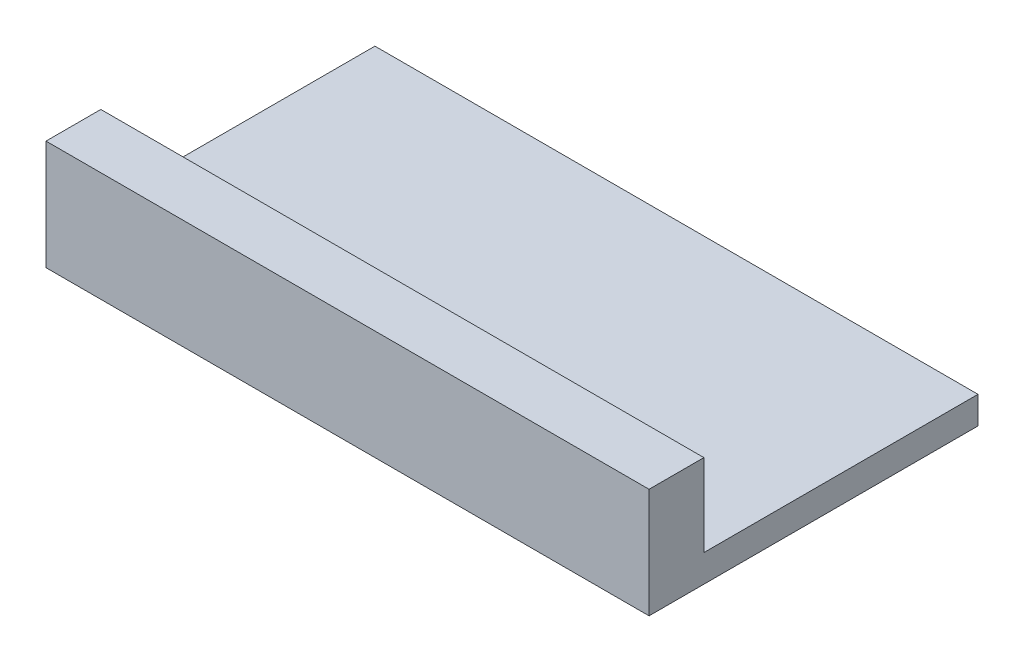
ISO-10303-21;
HEADER;
FILE_DESCRIPTION(('STEP AP214'),'2;1');
FILE_NAME('part.step','',(''),(''),'','','');
FILE_SCHEMA(('AUTOMOTIVE_DESIGN { 1 0 10303 214 1 1 1 1 }'));
ENDSEC;
DATA;
#1=APPLICATION_CONTEXT('core data for automotive mechanical design processes');
#2=APPLICATION_PROTOCOL_DEFINITION('international standard','automotive_design',2000,#1);
#3=PRODUCT_CONTEXT('',#1,'mechanical');
#4=PRODUCT('Part','Part','',(#3));
#5=PRODUCT_RELATED_PRODUCT_CATEGORY('part','',(#4));
#6=PRODUCT_DEFINITION_FORMATION('','',#4);
#7=PRODUCT_DEFINITION_CONTEXT('part definition',#1,'design');
#8=PRODUCT_DEFINITION('design','',#6,#7);
#9=PRODUCT_DEFINITION_SHAPE('','',#8);
#10=(LENGTH_UNIT() NAMED_UNIT(*) SI_UNIT(.MILLI.,.METRE.));
#11=(NAMED_UNIT(*) PLANE_ANGLE_UNIT() SI_UNIT($,.RADIAN.));
#12=(NAMED_UNIT(*) SI_UNIT($,.STERADIAN.) SOLID_ANGLE_UNIT());
#13=UNCERTAINTY_MEASURE_WITH_UNIT(LENGTH_MEASURE(1.E-05),#10,'distance_accuracy_value','');
#14=(GEOMETRIC_REPRESENTATION_CONTEXT(3) GLOBAL_UNCERTAINTY_ASSIGNED_CONTEXT((#13)) GLOBAL_UNIT_ASSIGNED_CONTEXT((#10,
#11,#12)) REPRESENTATION_CONTEXT('',''));
#15=CARTESIAN_POINT('',(0.,0.,0.));
#16=DIRECTION('',(0.,0.,1.));
#17=DIRECTION('',(1.,0.,0.));
#18=AXIS2_PLACEMENT_3D('',#15,#16,#17);
#19=CARTESIAN_POINT('',(-53.34,0.,21.59));
#20=DIRECTION('',(0.,1.,0.));
#21=DIRECTION('',(0.,0.,1.));
#22=AXIS2_PLACEMENT_3D('',#19,#20,#21);
#23=CYLINDRICAL_SURFACE('',#22,2.032);
#24=CARTESIAN_POINT('',(-53.34,6.35,21.59));
#25=DIRECTION('',(0.,1.,0.));
#26=DIRECTION('',(0.,0.,1.));
#27=AXIS2_PLACEMENT_3D('',#24,#25,#26);
#28=CIRCLE('',#27,2.032);
#29=CARTESIAN_POINT('',(-53.34,6.35,23.622));
#30=VERTEX_POINT('',#29);
#31=EDGE_CURVE('E178',#30,#30,#28,.T.);
#32=ORIENTED_EDGE('',*,*,#31,.T.);
#33=EDGE_LOOP('',(#32));
#34=FACE_BOUND('',#33,.T.);
#35=CARTESIAN_POINT('',(-53.34,3.048,21.59));
#36=DIRECTION('',(0.,-1.,0.));
#37=DIRECTION('',(0.,0.,-1.));
#38=AXIS2_PLACEMENT_3D('',#35,#36,#37);
#39=CIRCLE('',#38,2.032);
#40=CARTESIAN_POINT('',(-53.34,3.048,19.558));
#41=VERTEX_POINT('',#40);
#42=EDGE_CURVE('E37',#41,#41,#39,.F.);
#43=ORIENTED_EDGE('',*,*,#42,.F.);
#44=EDGE_LOOP('',(#43));
#45=FACE_BOUND('',#44,.T.);
#46=ADVANCED_FACE('F33',(#34,#45),#23,.F.);
#47=CARTESIAN_POINT('',(0.,6.35,0.));
#48=DIRECTION('',(0.,-1.,0.));
#49=DIRECTION('',(0.,0.,-1.));
#50=AXIS2_PLACEMENT_3D('',#47,#48,#49);
#51=PLANE('',#50);
#52=ORIENTED_EDGE('',*,*,#31,.F.);
#53=EDGE_LOOP('',(#52));
#54=FACE_BOUND('',#53,.T.);
#55=DIRECTION('',(-1.,0.,0.));
#56=VECTOR('',#55,1.);
#57=CARTESIAN_POINT('',(69.85,6.35,25.4));
#58=LINE('',#57,#56);
#59=CARTESIAN_POINT('',(69.85,6.35,25.4));
#60=VERTEX_POINT('',#59);
#61=CARTESIAN_POINT('',(-69.85,6.35,25.4));
#62=VERTEX_POINT('',#61);
#63=EDGE_CURVE('E57',#60,#62,#58,.T.);
#64=ORIENTED_EDGE('',*,*,#63,.F.);
#65=DIRECTION('',(0.,0.,-1.));
#66=VECTOR('',#65,1.);
#67=CARTESIAN_POINT('',(69.85,6.35,38.1));
#68=LINE('',#67,#66);
#69=CARTESIAN_POINT('',(69.85,6.35,-38.1));
#70=VERTEX_POINT('',#69);
#71=EDGE_CURVE('E201',#60,#70,#68,.T.);
#72=ORIENTED_EDGE('',*,*,#71,.T.);
#73=DIRECTION('',(-1.,0.,0.));
#74=VECTOR('',#73,1.);
#75=CARTESIAN_POINT('',(-69.85,6.35,-38.1));
#76=LINE('',#75,#74);
#77=CARTESIAN_POINT('',(-69.85,6.35,-38.1));
#78=VERTEX_POINT('',#77);
#79=EDGE_CURVE('E204',#70,#78,#76,.T.);
#80=ORIENTED_EDGE('',*,*,#79,.T.);
#81=DIRECTION('',(0.,0.,1.));
#82=VECTOR('',#81,1.);
#83=CARTESIAN_POINT('',(-69.85,6.35,38.1));
#84=LINE('',#83,#82);
#85=EDGE_CURVE('E199',#78,#62,#84,.T.);
#86=ORIENTED_EDGE('',*,*,#85,.T.);
#87=EDGE_LOOP('',(#64,#72,#80,#86));
#88=FACE_BOUND('',#87,.T.);
#89=ADVANCED_FACE('F240',(#54,#88),#51,.F.);
#90=CARTESIAN_POINT('',(-69.85,6.35,38.1));
#91=DIRECTION('',(1.,0.,0.));
#92=DIRECTION('',(0.,0.,-1.));
#93=AXIS2_PLACEMENT_3D('',#90,#91,#92);
#94=PLANE('',#93);
#95=DIRECTION('',(0.,0.,1.));
#96=VECTOR('',#95,1.);
#97=CARTESIAN_POINT('',(-69.85,0.,38.1));
#98=LINE('',#97,#96);
#99=CARTESIAN_POINT('',(-69.85,0.,-38.1));
#100=VERTEX_POINT('',#99);
#101=CARTESIAN_POINT('',(-69.85,0.,38.1));
#102=VERTEX_POINT('',#101);
#103=EDGE_CURVE('E198',#100,#102,#98,.T.);
#104=ORIENTED_EDGE('',*,*,#103,.T.);
#105=DIRECTION('',(0.,-1.,0.));
#106=VECTOR('',#105,1.);
#107=CARTESIAN_POINT('',(-69.85,6.35,38.1));
#108=LINE('',#107,#106);
#109=CARTESIAN_POINT('',(-69.85,25.4,38.1));
#110=VERTEX_POINT('',#109);
#111=EDGE_CURVE('E11',#110,#102,#108,.T.);
#112=ORIENTED_EDGE('',*,*,#111,.F.);
#113=DIRECTION('',(0.,0.,1.));
#114=VECTOR('',#113,1.);
#115=CARTESIAN_POINT('',(-69.85,25.4,25.4));
#116=LINE('',#115,#114);
#117=CARTESIAN_POINT('',(-69.85,25.4,25.4));
#118=VERTEX_POINT('',#117);
#119=EDGE_CURVE('E181',#118,#110,#116,.T.);
#120=ORIENTED_EDGE('',*,*,#119,.F.);
#121=DIRECTION('',(0.,-1.,0.));
#122=VECTOR('',#121,1.);
#123=CARTESIAN_POINT('',(-69.85,25.4,25.4));
#124=LINE('',#123,#122);
#125=EDGE_CURVE('E191',#118,#62,#124,.T.);
#126=ORIENTED_EDGE('',*,*,#125,.T.);
#127=ORIENTED_EDGE('',*,*,#85,.F.);
#128=DIRECTION('',(0.,-1.,0.));
#129=VECTOR('',#128,1.);
#130=CARTESIAN_POINT('',(-69.85,6.35,-38.1));
#131=LINE('',#130,#129);
#132=EDGE_CURVE('E206',#78,#100,#131,.T.);
#133=ORIENTED_EDGE('',*,*,#132,.T.);
#134=EDGE_LOOP('',(#104,#112,#120,#126,#127,#133));
#135=FACE_BOUND('',#134,.T.);
#136=ADVANCED_FACE('F35',(#135),#94,.F.);
#137=CARTESIAN_POINT('',(-69.85,6.35,38.1));
#138=DIRECTION('',(0.,0.,-1.));
#139=DIRECTION('',(-1.,0.,0.));
#140=AXIS2_PLACEMENT_3D('',#137,#138,#139);
#141=PLANE('',#140);
#142=DIRECTION('',(1.,0.,0.));
#143=VECTOR('',#142,1.);
#144=CARTESIAN_POINT('',(-69.85,0.,38.1));
#145=LINE('',#144,#143);
#146=CARTESIAN_POINT('',(69.85,0.,38.1));
#147=VERTEX_POINT('',#146);
#148=EDGE_CURVE('E209',#102,#147,#145,.T.);
#149=ORIENTED_EDGE('',*,*,#148,.T.);
#150=DIRECTION('',(0.,-1.,0.));
#151=VECTOR('',#150,1.);
#152=CARTESIAN_POINT('',(69.85,6.35,38.1));
#153=LINE('',#152,#151);
#154=CARTESIAN_POINT('',(69.85,25.4,38.1));
#155=VERTEX_POINT('',#154);
#156=EDGE_CURVE('E42',#155,#147,#153,.T.);
#157=ORIENTED_EDGE('',*,*,#156,.F.);
#158=DIRECTION('',(1.,0.,0.));
#159=VECTOR('',#158,1.);
#160=CARTESIAN_POINT('',(-69.85,25.4,38.1));
#161=LINE('',#160,#159);
#162=EDGE_CURVE('E184',#110,#155,#161,.T.);
#163=ORIENTED_EDGE('',*,*,#162,.F.);
#164=ORIENTED_EDGE('',*,*,#111,.T.);
#165=EDGE_LOOP('',(#149,#157,#163,#164));
#166=FACE_BOUND('',#165,.T.);
#167=ADVANCED_FACE('F246',(#166),#141,.F.);
#168=CARTESIAN_POINT('',(69.85,6.35,38.1));
#169=DIRECTION('',(-1.,0.,0.));
#170=DIRECTION('',(0.,0.,1.));
#171=AXIS2_PLACEMENT_3D('',#168,#169,#170);
#172=PLANE('',#171);
#173=DIRECTION('',(0.,0.,-1.));
#174=VECTOR('',#173,1.);
#175=CARTESIAN_POINT('',(69.85,0.,38.1));
#176=LINE('',#175,#174);
#177=CARTESIAN_POINT('',(69.85,0.,-38.1));
#178=VERTEX_POINT('',#177);
#179=EDGE_CURVE('E211',#147,#178,#176,.T.);
#180=ORIENTED_EDGE('',*,*,#179,.T.);
#181=DIRECTION('',(0.,-1.,0.));
#182=VECTOR('',#181,1.);
#183=CARTESIAN_POINT('',(69.85,6.35,-38.1));
#184=LINE('',#183,#182);
#185=EDGE_CURVE('E216',#70,#178,#184,.T.);
#186=ORIENTED_EDGE('',*,*,#185,.F.);
#187=ORIENTED_EDGE('',*,*,#71,.F.);
#188=DIRECTION('',(0.,-1.,0.));
#189=VECTOR('',#188,1.);
#190=CARTESIAN_POINT('',(69.85,25.4,25.4));
#191=LINE('',#190,#189);
#192=CARTESIAN_POINT('',(69.85,25.4,25.4));
#193=VERTEX_POINT('',#192);
#194=EDGE_CURVE('E195',#193,#60,#191,.T.);
#195=ORIENTED_EDGE('',*,*,#194,.F.);
#196=DIRECTION('',(0.,0.,-1.));
#197=VECTOR('',#196,1.);
#198=CARTESIAN_POINT('',(69.85,25.4,38.1));
#199=LINE('',#198,#197);
#200=EDGE_CURVE('E187',#155,#193,#199,.T.);
#201=ORIENTED_EDGE('',*,*,#200,.F.);
#202=ORIENTED_EDGE('',*,*,#156,.T.);
#203=EDGE_LOOP('',(#180,#186,#187,#195,#201,#202));
#204=FACE_BOUND('',#203,.T.);
#205=ADVANCED_FACE('F223',(#204),#172,.F.);
#206=CARTESIAN_POINT('',(-69.85,6.35,-38.1));
#207=DIRECTION('',(0.,0.,1.));
#208=DIRECTION('',(1.,0.,0.));
#209=AXIS2_PLACEMENT_3D('',#206,#207,#208);
#210=PLANE('',#209);
#211=DIRECTION('',(-1.,0.,0.));
#212=VECTOR('',#211,1.);
#213=CARTESIAN_POINT('',(-69.85,0.,-38.1));
#214=LINE('',#213,#212);
#215=EDGE_CURVE('E202',#178,#100,#214,.T.);
#216=ORIENTED_EDGE('',*,*,#215,.T.);
#217=ORIENTED_EDGE('',*,*,#132,.F.);
#218=ORIENTED_EDGE('',*,*,#79,.F.);
#219=ORIENTED_EDGE('',*,*,#185,.T.);
#220=EDGE_LOOP('',(#216,#217,#218,#219));
#221=FACE_BOUND('',#220,.T.);
#222=ADVANCED_FACE('F234',(#221),#210,.F.);
#223=CARTESIAN_POINT('',(0.,0.,0.));
#224=DIRECTION('',(0.,-1.,0.));
#225=DIRECTION('',(0.,0.,-1.));
#226=AXIS2_PLACEMENT_3D('',#223,#224,#225);
#227=PLANE('',#226);
#228=DIRECTION('',(-0.499999999999999,0.,0.866025403784439));
#229=VECTOR('',#228,1.);
#230=CARTESIAN_POINT('',(-48.514,0.,21.59));
#231=LINE('',#230,#229);
#232=CARTESIAN_POINT('',(-48.514,0.,21.59));
#233=VERTEX_POINT('',#232);
#234=CARTESIAN_POINT('',(-50.927,0.,25.7694385986637));
#235=VERTEX_POINT('',#234);
#236=EDGE_CURVE('E49',#233,#235,#231,.T.);
#237=ORIENTED_EDGE('',*,*,#236,.F.);
#238=DIRECTION('',(0.5,0.,0.866025403784439));
#239=VECTOR('',#238,1.);
#240=CARTESIAN_POINT('',(-50.927,0.,17.4105614013363));
#241=LINE('',#240,#239);
#242=CARTESIAN_POINT('',(-50.927,0.,17.4105614013363));
#243=VERTEX_POINT('',#242);
#244=EDGE_CURVE('E145',#243,#233,#241,.T.);
#245=ORIENTED_EDGE('',*,*,#244,.F.);
#246=DIRECTION('',(1.,0.,0.));
#247=VECTOR('',#246,1.);
#248=CARTESIAN_POINT('',(-55.753,0.,17.4105614013363));
#249=LINE('',#248,#247);
#250=CARTESIAN_POINT('',(-55.753,0.,17.4105614013363));
#251=VERTEX_POINT('',#250);
#252=EDGE_CURVE('E148',#251,#243,#249,.T.);
#253=ORIENTED_EDGE('',*,*,#252,.F.);
#254=DIRECTION('',(0.5,0.,-0.866025403784439));
#255=VECTOR('',#254,1.);
#256=CARTESIAN_POINT('',(-58.166,0.,21.59));
#257=LINE('',#256,#255);
#258=CARTESIAN_POINT('',(-58.166,0.,21.59));
#259=VERTEX_POINT('',#258);
#260=EDGE_CURVE('E164',#259,#251,#257,.T.);
#261=ORIENTED_EDGE('',*,*,#260,.F.);
#262=DIRECTION('',(-0.499999999999999,0.,-0.866025403784439));
#263=VECTOR('',#262,1.);
#264=CARTESIAN_POINT('',(-55.753,0.,25.7694385986637));
#265=LINE('',#264,#263);
#266=CARTESIAN_POINT('',(-55.753,0.,25.7694385986637));
#267=VERTEX_POINT('',#266);
#268=EDGE_CURVE('E161',#267,#259,#265,.T.);
#269=ORIENTED_EDGE('',*,*,#268,.F.);
#270=DIRECTION('',(-1.,0.,0.));
#271=VECTOR('',#270,1.);
#272=CARTESIAN_POINT('',(-50.927,0.,25.7694385986637));
#273=LINE('',#272,#271);
#274=EDGE_CURVE('E159',#235,#267,#273,.T.);
#275=ORIENTED_EDGE('',*,*,#274,.F.);
#276=EDGE_LOOP('',(#237,#245,#253,#261,#269,#275));
#277=FACE_BOUND('',#276,.T.);
#278=ORIENTED_EDGE('',*,*,#103,.F.);
#279=ORIENTED_EDGE('',*,*,#215,.F.);
#280=ORIENTED_EDGE('',*,*,#179,.F.);
#281=ORIENTED_EDGE('',*,*,#148,.F.);
#282=EDGE_LOOP('',(#278,#279,#280,#281));
#283=FACE_BOUND('',#282,.T.);
#284=ADVANCED_FACE('F231',(#277,#283),#227,.T.);
#285=CARTESIAN_POINT('',(69.85,25.4,25.4));
#286=DIRECTION('',(0.,0.,1.));
#287=DIRECTION('',(1.,0.,0.));
#288=AXIS2_PLACEMENT_3D('',#285,#286,#287);
#289=PLANE('',#288);
#290=ORIENTED_EDGE('',*,*,#63,.T.);
#291=ORIENTED_EDGE('',*,*,#125,.F.);
#292=DIRECTION('',(-1.,0.,0.));
#293=VECTOR('',#292,1.);
#294=CARTESIAN_POINT('',(69.85,25.4,25.4));
#295=LINE('',#294,#293);
#296=EDGE_CURVE('E189',#193,#118,#295,.T.);
#297=ORIENTED_EDGE('',*,*,#296,.F.);
#298=ORIENTED_EDGE('',*,*,#194,.T.);
#299=EDGE_LOOP('',(#290,#291,#297,#298));
#300=FACE_BOUND('',#299,.T.);
#301=ADVANCED_FACE('F242',(#300),#289,.F.);
#302=CARTESIAN_POINT('',(0.,25.4,0.));
#303=DIRECTION('',(0.,1.,0.));
#304=DIRECTION('',(0.,0.,1.));
#305=AXIS2_PLACEMENT_3D('',#302,#303,#304);
#306=PLANE('',#305);
#307=ORIENTED_EDGE('',*,*,#119,.T.);
#308=ORIENTED_EDGE('',*,*,#162,.T.);
#309=ORIENTED_EDGE('',*,*,#200,.T.);
#310=ORIENTED_EDGE('',*,*,#296,.T.);
#311=EDGE_LOOP('',(#307,#308,#309,#310));
#312=FACE_BOUND('',#311,.T.);
#313=ADVANCED_FACE('F245',(#312),#306,.T.);
#314=CARTESIAN_POINT('',(0.,3.048,0.));
#315=DIRECTION('',(0.,-1.,0.));
#316=DIRECTION('',(0.,0.,-1.));
#317=AXIS2_PLACEMENT_3D('',#314,#315,#316);
#318=PLANE('',#317);
#319=DIRECTION('',(-0.499999999999999,0.,0.866025403784439));
#320=VECTOR('',#319,1.);
#321=CARTESIAN_POINT('',(-48.514,3.048,21.59));
#322=LINE('',#321,#320);
#323=CARTESIAN_POINT('',(-48.514,3.048,21.59));
#324=VERTEX_POINT('',#323);
#325=CARTESIAN_POINT('',(-50.927,3.048,25.7694385986637));
#326=VERTEX_POINT('',#325);
#327=EDGE_CURVE('E125',#324,#326,#322,.T.);
#328=ORIENTED_EDGE('',*,*,#327,.T.);
#329=DIRECTION('',(-1.,0.,0.));
#330=VECTOR('',#329,1.);
#331=CARTESIAN_POINT('',(-50.927,3.048,25.7694385986637));
#332=LINE('',#331,#330);
#333=CARTESIAN_POINT('',(-55.753,3.048,25.7694385986637));
#334=VERTEX_POINT('',#333);
#335=EDGE_CURVE('E134',#326,#334,#332,.T.);
#336=ORIENTED_EDGE('',*,*,#335,.T.);
#337=DIRECTION('',(-0.499999999999999,0.,-0.866025403784439));
#338=VECTOR('',#337,1.);
#339=CARTESIAN_POINT('',(-55.753,3.048,25.7694385986637));
#340=LINE('',#339,#338);
#341=CARTESIAN_POINT('',(-58.166,3.048,21.59));
#342=VERTEX_POINT('',#341);
#343=EDGE_CURVE('E139',#334,#342,#340,.T.);
#344=ORIENTED_EDGE('',*,*,#343,.T.);
#345=DIRECTION('',(0.5,0.,-0.866025403784439));
#346=VECTOR('',#345,1.);
#347=CARTESIAN_POINT('',(-58.166,3.048,21.59));
#348=LINE('',#347,#346);
#349=CARTESIAN_POINT('',(-55.753,3.048,17.4105614013363));
#350=VERTEX_POINT('',#349);
#351=EDGE_CURVE('E152',#342,#350,#348,.T.);
#352=ORIENTED_EDGE('',*,*,#351,.T.);
#353=DIRECTION('',(1.,0.,0.));
#354=VECTOR('',#353,1.);
#355=CARTESIAN_POINT('',(-55.753,3.048,17.4105614013363));
#356=LINE('',#355,#354);
#357=CARTESIAN_POINT('',(-50.927,3.048,17.4105614013363));
#358=VERTEX_POINT('',#357);
#359=EDGE_CURVE('E155',#350,#358,#356,.T.);
#360=ORIENTED_EDGE('',*,*,#359,.T.);
#361=DIRECTION('',(0.5,0.,0.866025403784439));
#362=VECTOR('',#361,1.);
#363=CARTESIAN_POINT('',(-50.927,3.048,17.4105614013363));
#364=LINE('',#363,#362);
#365=EDGE_CURVE('E131',#358,#324,#364,.T.);
#366=ORIENTED_EDGE('',*,*,#365,.T.);
#367=EDGE_LOOP('',(#328,#336,#344,#352,#360,#366));
#368=FACE_BOUND('',#367,.T.);
#369=ORIENTED_EDGE('',*,*,#42,.T.);
#370=EDGE_LOOP('',(#369));
#371=FACE_BOUND('',#370,.T.);
#372=ADVANCED_FACE('F141',(#368,#371),#318,.T.);
#373=CARTESIAN_POINT('',(-48.514,3.048,21.59));
#374=DIRECTION('',(0.866025403784439,0.,0.499999999999999));
#375=DIRECTION('',(0.5,0.,-0.866025403784439));
#376=AXIS2_PLACEMENT_3D('',#373,#374,#375);
#377=PLANE('',#376);
#378=ORIENTED_EDGE('',*,*,#236,.T.);
#379=DIRECTION('',(0.,-1.,0.));
#380=VECTOR('',#379,1.);
#381=CARTESIAN_POINT('',(-50.927,3.048,25.7694385986637));
#382=LINE('',#381,#380);
#383=EDGE_CURVE('E121',#326,#235,#382,.T.);
#384=ORIENTED_EDGE('',*,*,#383,.F.);
#385=ORIENTED_EDGE('',*,*,#327,.F.);
#386=DIRECTION('',(0.,-1.,0.));
#387=VECTOR('',#386,1.);
#388=CARTESIAN_POINT('',(-48.514,3.048,21.59));
#389=LINE('',#388,#387);
#390=EDGE_CURVE('E169',#324,#233,#389,.T.);
#391=ORIENTED_EDGE('',*,*,#390,.T.);
#392=EDGE_LOOP('',(#378,#384,#385,#391));
#393=FACE_BOUND('',#392,.T.);
#394=ADVANCED_FACE('F123',(#393),#377,.F.);
#395=CARTESIAN_POINT('',(-50.927,3.048,17.4105614013363));
#396=DIRECTION('',(0.866025403784439,0.,-0.5));
#397=DIRECTION('',(-0.5,0.,-0.866025403784439));
#398=AXIS2_PLACEMENT_3D('',#395,#396,#397);
#399=PLANE('',#398);
#400=ORIENTED_EDGE('',*,*,#244,.T.);
#401=ORIENTED_EDGE('',*,*,#390,.F.);
#402=ORIENTED_EDGE('',*,*,#365,.F.);
#403=DIRECTION('',(0.,-1.,0.));
#404=VECTOR('',#403,1.);
#405=CARTESIAN_POINT('',(-50.927,3.048,17.4105614013363));
#406=LINE('',#405,#404);
#407=EDGE_CURVE('E171',#358,#243,#406,.T.);
#408=ORIENTED_EDGE('',*,*,#407,.T.);
#409=EDGE_LOOP('',(#400,#401,#402,#408));
#410=FACE_BOUND('',#409,.T.);
#411=ADVANCED_FACE('F303',(#410),#399,.F.);
#412=CARTESIAN_POINT('',(-55.753,3.048,17.4105614013363));
#413=DIRECTION('',(0.,0.,-1.));
#414=DIRECTION('',(-1.,0.,0.));
#415=AXIS2_PLACEMENT_3D('',#412,#413,#414);
#416=PLANE('',#415);
#417=ORIENTED_EDGE('',*,*,#252,.T.);
#418=ORIENTED_EDGE('',*,*,#407,.F.);
#419=ORIENTED_EDGE('',*,*,#359,.F.);
#420=DIRECTION('',(0.,-1.,0.));
#421=VECTOR('',#420,1.);
#422=CARTESIAN_POINT('',(-55.753,3.048,17.4105614013363));
#423=LINE('',#422,#421);
#424=EDGE_CURVE('E173',#350,#251,#423,.T.);
#425=ORIENTED_EDGE('',*,*,#424,.T.);
#426=EDGE_LOOP('',(#417,#418,#419,#425));
#427=FACE_BOUND('',#426,.T.);
#428=ADVANCED_FACE('F309',(#427),#416,.F.);
#429=CARTESIAN_POINT('',(-58.166,3.048,21.59));
#430=DIRECTION('',(-0.866025403784439,0.,-0.5));
#431=DIRECTION('',(-0.5,0.,0.866025403784439));
#432=AXIS2_PLACEMENT_3D('',#429,#430,#431);
#433=PLANE('',#432);
#434=ORIENTED_EDGE('',*,*,#260,.T.);
#435=ORIENTED_EDGE('',*,*,#424,.F.);
#436=ORIENTED_EDGE('',*,*,#351,.F.);
#437=DIRECTION('',(0.,-1.,0.));
#438=VECTOR('',#437,1.);
#439=CARTESIAN_POINT('',(-58.166,3.048,21.59));
#440=LINE('',#439,#438);
#441=EDGE_CURVE('E175',#342,#259,#440,.T.);
#442=ORIENTED_EDGE('',*,*,#441,.T.);
#443=EDGE_LOOP('',(#434,#435,#436,#442));
#444=FACE_BOUND('',#443,.T.);
#445=ADVANCED_FACE('F317',(#444),#433,.F.);
#446=CARTESIAN_POINT('',(-55.753,3.048,25.7694385986637));
#447=DIRECTION('',(-0.866025403784439,0.,0.499999999999999));
#448=DIRECTION('',(0.5,0.,0.866025403784439));
#449=AXIS2_PLACEMENT_3D('',#446,#447,#448);
#450=PLANE('',#449);
#451=ORIENTED_EDGE('',*,*,#268,.T.);
#452=ORIENTED_EDGE('',*,*,#441,.F.);
#453=ORIENTED_EDGE('',*,*,#343,.F.);
#454=DIRECTION('',(0.,-1.,0.));
#455=VECTOR('',#454,1.);
#456=CARTESIAN_POINT('',(-55.753,3.048,25.7694385986637));
#457=LINE('',#456,#455);
#458=EDGE_CURVE('E130',#334,#267,#457,.T.);
#459=ORIENTED_EDGE('',*,*,#458,.T.);
#460=EDGE_LOOP('',(#451,#452,#453,#459));
#461=FACE_BOUND('',#460,.T.);
#462=ADVANCED_FACE('F325',(#461),#450,.F.);
#463=CARTESIAN_POINT('',(-50.927,3.048,25.7694385986637));
#464=DIRECTION('',(0.,0.,1.));
#465=DIRECTION('',(1.,0.,0.));
#466=AXIS2_PLACEMENT_3D('',#463,#464,#465);
#467=PLANE('',#466);
#468=ORIENTED_EDGE('',*,*,#274,.T.);
#469=ORIENTED_EDGE('',*,*,#458,.F.);
#470=ORIENTED_EDGE('',*,*,#335,.F.);
#471=ORIENTED_EDGE('',*,*,#383,.T.);
#472=EDGE_LOOP('',(#468,#469,#470,#471));
#473=FACE_BOUND('',#472,.T.);
#474=ADVANCED_FACE('F135',(#473),#467,.F.);
#475=CLOSED_SHELL('',(#46,#89,#136,#167,#205,#222,#284,#301,#313,#372,#394,#411,#428,#445,#462,#474));
#476=MANIFOLD_SOLID_BREP('B2',#475);
#477=ADVANCED_BREP_SHAPE_REPRESENTATION('',(#18,#476),#14);
#478=SHAPE_DEFINITION_REPRESENTATION(#9,#477);
ENDSEC;
END-ISO-10303-21;
